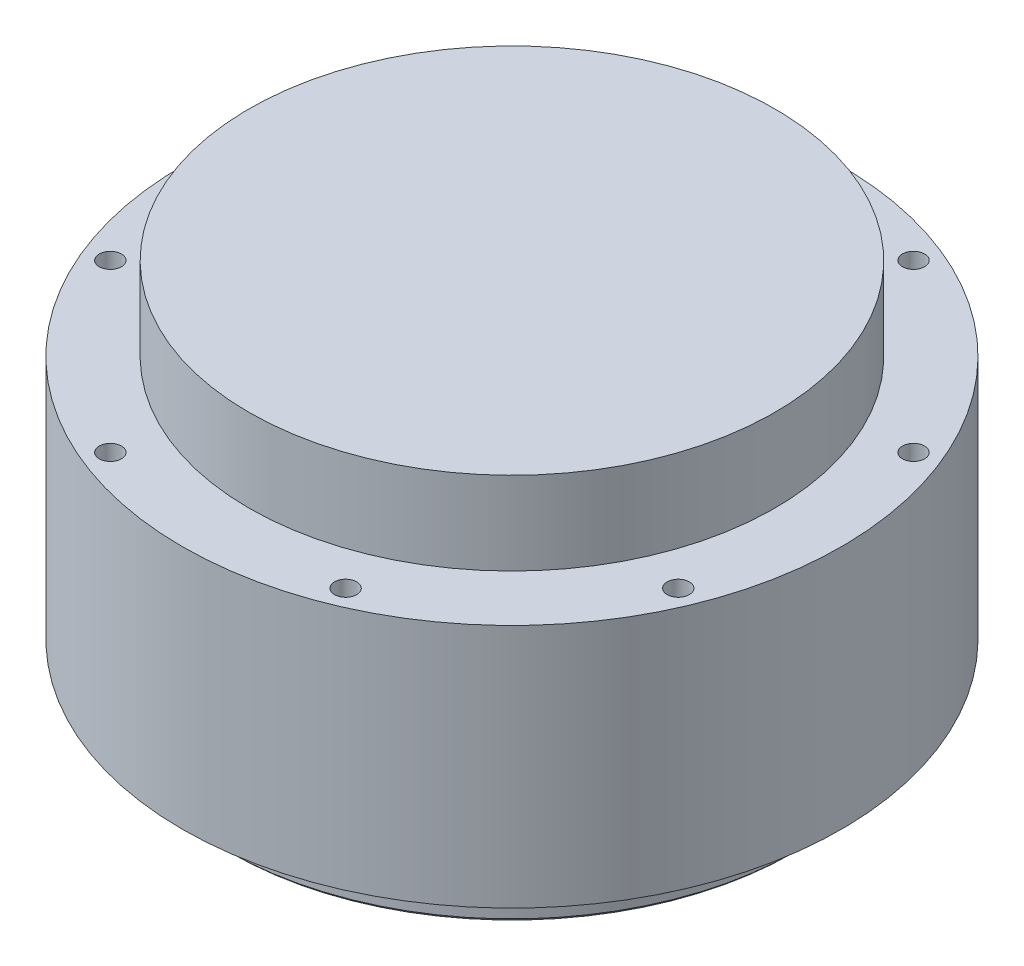
ISO-10303-21;
HEADER;
FILE_DESCRIPTION(('STEP AP214'),'2;1');
FILE_NAME('part.step','',(''),(''),'','','');
FILE_SCHEMA(('AUTOMOTIVE_DESIGN { 1 0 10303 214 1 1 1 1 }'));
ENDSEC;
DATA;
#1=APPLICATION_CONTEXT('core data for automotive mechanical design processes');
#2=APPLICATION_PROTOCOL_DEFINITION('international standard','automotive_design',2000,#1);
#3=PRODUCT_CONTEXT('',#1,'mechanical');
#4=PRODUCT('Part','Part','',(#3));
#5=PRODUCT_RELATED_PRODUCT_CATEGORY('part','',(#4));
#6=PRODUCT_DEFINITION_FORMATION('','',#4);
#7=PRODUCT_DEFINITION_CONTEXT('part definition',#1,'design');
#8=PRODUCT_DEFINITION('design','',#6,#7);
#9=PRODUCT_DEFINITION_SHAPE('','',#8);
#10=(LENGTH_UNIT() NAMED_UNIT(*) SI_UNIT(.MILLI.,.METRE.));
#11=(NAMED_UNIT(*) PLANE_ANGLE_UNIT() SI_UNIT($,.RADIAN.));
#12=(NAMED_UNIT(*) SI_UNIT($,.STERADIAN.) SOLID_ANGLE_UNIT());
#13=UNCERTAINTY_MEASURE_WITH_UNIT(LENGTH_MEASURE(1.E-05),#10,'distance_accuracy_value','');
#14=(GEOMETRIC_REPRESENTATION_CONTEXT(3) GLOBAL_UNCERTAINTY_ASSIGNED_CONTEXT((#13)) GLOBAL_UNIT_ASSIGNED_CONTEXT((#10,
#11,#12)) REPRESENTATION_CONTEXT('',''));
#15=CARTESIAN_POINT('',(0.,0.,0.));
#16=DIRECTION('',(0.,0.,1.));
#17=DIRECTION('',(1.,0.,0.));
#18=AXIS2_PLACEMENT_3D('',#15,#16,#17);
#19=CARTESIAN_POINT('',(0.,33.05,0.));
#20=DIRECTION('',(0.,1.,0.));
#21=DIRECTION('',(0.,0.,1.));
#22=AXIS2_PLACEMENT_3D('',#19,#20,#21);
#23=PLANE('',#22);
#24=CARTESIAN_POINT('',(0.,33.05,0.));
#25=DIRECTION('',(0.,1.,0.));
#26=DIRECTION('',(0.,0.,1.));
#27=AXIS2_PLACEMENT_3D('',#24,#25,#26);
#28=CIRCLE('',#27,35.5);
#29=CARTESIAN_POINT('',(0.,33.05,35.5));
#30=VERTEX_POINT('',#29);
#31=EDGE_CURVE('E110',#30,#30,#28,.T.);
#32=ORIENTED_EDGE('',*,*,#31,.F.);
#33=EDGE_LOOP('',(#32));
#34=FACE_BOUND('',#33,.T.);
#35=CARTESIAN_POINT('',(-38.3410005992179,33.05,-15.8813624431494));
#36=DIRECTION('',(0.,1.,0.));
#37=DIRECTION('',(0.,0.,1.));
#38=AXIS2_PLACEMENT_3D('',#35,#36,#37);
#39=CIRCLE('',#38,1.50000000000199);
#40=CARTESIAN_POINT('',(-38.3410005992179,33.05,-14.3813624431474));
#41=VERTEX_POINT('',#40);
#42=EDGE_CURVE('E95',#41,#41,#39,.T.);
#43=ORIENTED_EDGE('',*,*,#42,.F.);
#44=EDGE_LOOP('',(#43));
#45=FACE_BOUND('',#44,.T.);
#46=CARTESIAN_POINT('',(-15.8813624431488,33.05,38.3410005992194));
#47=DIRECTION('',(0.,1.,0.));
#48=DIRECTION('',(0.,0.,1.));
#49=AXIS2_PLACEMENT_3D('',#46,#47,#48);
#50=CIRCLE('',#49,1.50000000000202);
#51=CARTESIAN_POINT('',(-15.8813624431488,33.05,39.8410005992215));
#52=VERTEX_POINT('',#51);
#53=EDGE_CURVE('E83',#52,#52,#50,.T.);
#54=ORIENTED_EDGE('',*,*,#53,.F.);
#55=EDGE_LOOP('',(#54));
#56=FACE_BOUND('',#55,.T.);
#57=CARTESIAN_POINT('',(38.34100059922,33.05,15.8813624431504));
#58=DIRECTION('',(0.,1.,0.));
#59=DIRECTION('',(0.,0.,1.));
#60=AXIS2_PLACEMENT_3D('',#57,#58,#59);
#61=CIRCLE('',#60,1.50000000000025);
#62=CARTESIAN_POINT('',(38.34100059922,33.05,17.3813624431506));
#63=VERTEX_POINT('',#62);
#64=EDGE_CURVE('E71',#63,#63,#61,.T.);
#65=ORIENTED_EDGE('',*,*,#64,.F.);
#66=EDGE_LOOP('',(#65));
#67=FACE_BOUND('',#66,.T.);
#68=CARTESIAN_POINT('',(15.881362443151,33.05,-38.3410005992185));
#69=DIRECTION('',(0.,1.,0.));
#70=DIRECTION('',(0.,0.,1.));
#71=AXIS2_PLACEMENT_3D('',#68,#69,#70);
#72=CIRCLE('',#71,1.5);
#73=CARTESIAN_POINT('',(15.881362443151,33.05,-36.8410005992185));
#74=VERTEX_POINT('',#73);
#75=EDGE_CURVE('E59',#74,#74,#72,.T.);
#76=ORIENTED_EDGE('',*,*,#75,.F.);
#77=EDGE_LOOP('',(#76));
#78=FACE_BOUND('',#77,.T.);
#79=CARTESIAN_POINT('',(0.,33.05,0.));
#80=DIRECTION('',(0.,1.,0.));
#81=DIRECTION('',(0.,0.,1.));
#82=AXIS2_PLACEMENT_3D('',#79,#80,#81);
#83=CIRCLE('',#82,44.5);
#84=CARTESIAN_POINT('',(0.,33.05,44.5));
#85=VERTEX_POINT('',#84);
#86=EDGE_CURVE('E53',#85,#85,#83,.T.);
#87=ORIENTED_EDGE('',*,*,#86,.T.);
#88=EDGE_LOOP('',(#87));
#89=FACE_BOUND('',#88,.T.);
#90=CARTESIAN_POINT('',(38.3410005992183,33.05,-15.8813624431514));
#91=DIRECTION('',(0.,1.,0.));
#92=DIRECTION('',(0.,0.,1.));
#93=AXIS2_PLACEMENT_3D('',#90,#91,#92);
#94=CIRCLE('',#93,1.50000000000001);
#95=CARTESIAN_POINT('',(38.3410005992183,33.05,-14.3813624431514));
#96=VERTEX_POINT('',#95);
#97=EDGE_CURVE('E65',#96,#96,#94,.T.);
#98=ORIENTED_EDGE('',*,*,#97,.F.);
#99=EDGE_LOOP('',(#98));
#100=FACE_BOUND('',#99,.T.);
#101=CARTESIAN_POINT('',(15.8813624431536,33.05,38.3410005992183));
#102=DIRECTION('',(0.,1.,0.));
#103=DIRECTION('',(0.,0.,1.));
#104=AXIS2_PLACEMENT_3D('',#101,#102,#103);
#105=CIRCLE('',#104,1.50000000000115);
#106=CARTESIAN_POINT('',(15.8813624431536,33.05,39.8410005992195));
#107=VERTEX_POINT('',#106);
#108=EDGE_CURVE('E77',#107,#107,#105,.T.);
#109=ORIENTED_EDGE('',*,*,#108,.F.);
#110=EDGE_LOOP('',(#109));
#111=FACE_BOUND('',#110,.T.);
#112=CARTESIAN_POINT('',(-38.3410005992168,33.05,15.881362443153));
#113=DIRECTION('',(0.,1.,0.));
#114=DIRECTION('',(0.,0.,1.));
#115=AXIS2_PLACEMENT_3D('',#112,#113,#114);
#116=CIRCLE('',#115,1.50000000000235);
#117=CARTESIAN_POINT('',(-38.3410005992168,33.05,17.3813624431554));
#118=VERTEX_POINT('',#117);
#119=EDGE_CURVE('E89',#118,#118,#116,.T.);
#120=ORIENTED_EDGE('',*,*,#119,.F.);
#121=EDGE_LOOP('',(#120));
#122=FACE_BOUND('',#121,.T.);
#123=CARTESIAN_POINT('',(-15.8813624431515,33.05,-38.3410005992174));
#124=DIRECTION('',(0.,1.,0.));
#125=DIRECTION('',(0.,0.,1.));
#126=AXIS2_PLACEMENT_3D('',#123,#124,#125);
#127=CIRCLE('',#126,1.50000000000119);
#128=CARTESIAN_POINT('',(-15.8813624431515,33.05,-36.8410005992162));
#129=VERTEX_POINT('',#128);
#130=EDGE_CURVE('E101',#129,#129,#127,.T.);
#131=ORIENTED_EDGE('',*,*,#130,.F.);
#132=EDGE_LOOP('',(#131));
#133=FACE_BOUND('',#132,.T.);
#134=ADVANCED_FACE('F37',(#34,#45,#56,#67,#78,#89,#100,#111,#122,#133),#23,.T.);
#135=CARTESIAN_POINT('',(0.,0.,0.));
#136=DIRECTION('',(0.,1.,0.));
#137=DIRECTION('',(0.,0.,1.));
#138=AXIS2_PLACEMENT_3D('',#135,#136,#137);
#139=PLANE('',#138);
#140=CARTESIAN_POINT('',(0.,0.,0.));
#141=DIRECTION('',(0.,-1.,0.));
#142=DIRECTION('',(0.,0.,-1.));
#143=AXIS2_PLACEMENT_3D('',#140,#141,#142);
#144=CIRCLE('',#143,38.5);
#145=CARTESIAN_POINT('',(0.,0.,-38.5));
#146=VERTEX_POINT('',#145);
#147=EDGE_CURVE('E49',#146,#146,#144,.T.);
#148=ORIENTED_EDGE('',*,*,#147,.F.);
#149=EDGE_LOOP('',(#148));
#150=FACE_BOUND('',#149,.T.);
#151=CARTESIAN_POINT('',(0.,0.,0.));
#152=DIRECTION('',(0.,1.,0.));
#153=DIRECTION('',(0.,0.,1.));
#154=AXIS2_PLACEMENT_3D('',#151,#152,#153);
#155=CIRCLE('',#154,44.5);
#156=CARTESIAN_POINT('',(0.,0.,44.5));
#157=VERTEX_POINT('',#156);
#158=EDGE_CURVE('E56',#157,#157,#155,.T.);
#159=ORIENTED_EDGE('',*,*,#158,.F.);
#160=EDGE_LOOP('',(#159));
#161=FACE_BOUND('',#160,.T.);
#162=CARTESIAN_POINT('',(15.881362443151,0.,-38.3410005992185));
#163=DIRECTION('',(0.,1.,0.));
#164=DIRECTION('',(0.,0.,1.));
#165=AXIS2_PLACEMENT_3D('',#162,#163,#164);
#166=CIRCLE('',#165,1.5);
#167=CARTESIAN_POINT('',(15.881362443151,0.,-36.8410005992185));
#168=VERTEX_POINT('',#167);
#169=EDGE_CURVE('E62',#168,#168,#166,.T.);
#170=ORIENTED_EDGE('',*,*,#169,.T.);
#171=EDGE_LOOP('',(#170));
#172=FACE_BOUND('',#171,.T.);
#173=CARTESIAN_POINT('',(38.3410005992183,0.,-15.8813624431514));
#174=DIRECTION('',(0.,1.,0.));
#175=DIRECTION('',(0.,0.,1.));
#176=AXIS2_PLACEMENT_3D('',#173,#174,#175);
#177=CIRCLE('',#176,1.50000000000001);
#178=CARTESIAN_POINT('',(38.3410005992183,0.,-14.3813624431514));
#179=VERTEX_POINT('',#178);
#180=EDGE_CURVE('E68',#179,#179,#177,.T.);
#181=ORIENTED_EDGE('',*,*,#180,.T.);
#182=EDGE_LOOP('',(#181));
#183=FACE_BOUND('',#182,.T.);
#184=CARTESIAN_POINT('',(38.34100059922,0.,15.8813624431504));
#185=DIRECTION('',(0.,1.,0.));
#186=DIRECTION('',(0.,0.,1.));
#187=AXIS2_PLACEMENT_3D('',#184,#185,#186);
#188=CIRCLE('',#187,1.50000000000025);
#189=CARTESIAN_POINT('',(38.34100059922,0.,17.3813624431506));
#190=VERTEX_POINT('',#189);
#191=EDGE_CURVE('E74',#190,#190,#188,.T.);
#192=ORIENTED_EDGE('',*,*,#191,.T.);
#193=EDGE_LOOP('',(#192));
#194=FACE_BOUND('',#193,.T.);
#195=CARTESIAN_POINT('',(15.8813624431536,0.,38.3410005992183));
#196=DIRECTION('',(0.,1.,0.));
#197=DIRECTION('',(0.,0.,1.));
#198=AXIS2_PLACEMENT_3D('',#195,#196,#197);
#199=CIRCLE('',#198,1.50000000000115);
#200=CARTESIAN_POINT('',(15.8813624431536,0.,39.8410005992195));
#201=VERTEX_POINT('',#200);
#202=EDGE_CURVE('E80',#201,#201,#199,.T.);
#203=ORIENTED_EDGE('',*,*,#202,.T.);
#204=EDGE_LOOP('',(#203));
#205=FACE_BOUND('',#204,.T.);
#206=CARTESIAN_POINT('',(-15.8813624431488,0.,38.3410005992194));
#207=DIRECTION('',(0.,1.,0.));
#208=DIRECTION('',(0.,0.,1.));
#209=AXIS2_PLACEMENT_3D('',#206,#207,#208);
#210=CIRCLE('',#209,1.50000000000202);
#211=CARTESIAN_POINT('',(-15.8813624431488,0.,39.8410005992215));
#212=VERTEX_POINT('',#211);
#213=EDGE_CURVE('E86',#212,#212,#210,.T.);
#214=ORIENTED_EDGE('',*,*,#213,.T.);
#215=EDGE_LOOP('',(#214));
#216=FACE_BOUND('',#215,.T.);
#217=CARTESIAN_POINT('',(-38.3410005992168,0.,15.881362443153));
#218=DIRECTION('',(0.,1.,0.));
#219=DIRECTION('',(0.,0.,1.));
#220=AXIS2_PLACEMENT_3D('',#217,#218,#219);
#221=CIRCLE('',#220,1.50000000000235);
#222=CARTESIAN_POINT('',(-38.3410005992168,0.,17.3813624431554));
#223=VERTEX_POINT('',#222);
#224=EDGE_CURVE('E92',#223,#223,#221,.T.);
#225=ORIENTED_EDGE('',*,*,#224,.T.);
#226=EDGE_LOOP('',(#225));
#227=FACE_BOUND('',#226,.T.);
#228=CARTESIAN_POINT('',(-38.3410005992179,0.,-15.8813624431494));
#229=DIRECTION('',(0.,1.,0.));
#230=DIRECTION('',(0.,0.,1.));
#231=AXIS2_PLACEMENT_3D('',#228,#229,#230);
#232=CIRCLE('',#231,1.50000000000199);
#233=CARTESIAN_POINT('',(-38.3410005992179,0.,-14.3813624431474));
#234=VERTEX_POINT('',#233);
#235=EDGE_CURVE('E98',#234,#234,#232,.T.);
#236=ORIENTED_EDGE('',*,*,#235,.T.);
#237=EDGE_LOOP('',(#236));
#238=FACE_BOUND('',#237,.T.);
#239=CARTESIAN_POINT('',(-15.8813624431515,0.,-38.3410005992174));
#240=DIRECTION('',(0.,1.,0.));
#241=DIRECTION('',(0.,0.,1.));
#242=AXIS2_PLACEMENT_3D('',#239,#240,#241);
#243=CIRCLE('',#242,1.50000000000119);
#244=CARTESIAN_POINT('',(-15.8813624431515,0.,-36.8410005992162));
#245=VERTEX_POINT('',#244);
#246=EDGE_CURVE('E104',#245,#245,#243,.T.);
#247=ORIENTED_EDGE('',*,*,#246,.T.);
#248=EDGE_LOOP('',(#247));
#249=FACE_BOUND('',#248,.T.);
#250=ADVANCED_FACE('F142',(#150,#161,#172,#183,#194,#205,#216,#227,#238,#249),#139,.F.);
#251=CARTESIAN_POINT('',(0.,33.05,0.));
#252=DIRECTION('',(0.,-1.,0.));
#253=DIRECTION('',(0.,0.,-1.));
#254=AXIS2_PLACEMENT_3D('',#251,#252,#253);
#255=CYLINDRICAL_SURFACE('',#254,44.5);
#256=ORIENTED_EDGE('',*,*,#86,.F.);
#257=EDGE_LOOP('',(#256));
#258=FACE_BOUND('',#257,.T.);
#259=ORIENTED_EDGE('',*,*,#158,.T.);
#260=EDGE_LOOP('',(#259));
#261=FACE_BOUND('',#260,.T.);
#262=ADVANCED_FACE('F148',(#258,#261),#255,.T.);
#263=CARTESIAN_POINT('',(15.881362443151,33.05,-38.3410005992185));
#264=DIRECTION('',(0.,-1.,0.));
#265=DIRECTION('',(0.,0.,-1.));
#266=AXIS2_PLACEMENT_3D('',#263,#264,#265);
#267=CYLINDRICAL_SURFACE('',#266,1.5);
#268=ORIENTED_EDGE('',*,*,#75,.T.);
#269=EDGE_LOOP('',(#268));
#270=FACE_BOUND('',#269,.T.);
#271=ORIENTED_EDGE('',*,*,#169,.F.);
#272=EDGE_LOOP('',(#271));
#273=FACE_BOUND('',#272,.T.);
#274=ADVANCED_FACE('F154',(#270,#273),#267,.F.);
#275=CARTESIAN_POINT('',(38.3410005992183,33.05,-15.8813624431514));
#276=DIRECTION('',(0.,-1.,0.));
#277=DIRECTION('',(0.,0.,-1.));
#278=AXIS2_PLACEMENT_3D('',#275,#276,#277);
#279=CYLINDRICAL_SURFACE('',#278,1.50000000000001);
#280=ORIENTED_EDGE('',*,*,#97,.T.);
#281=EDGE_LOOP('',(#280));
#282=FACE_BOUND('',#281,.T.);
#283=ORIENTED_EDGE('',*,*,#180,.F.);
#284=EDGE_LOOP('',(#283));
#285=FACE_BOUND('',#284,.T.);
#286=ADVANCED_FACE('F161',(#282,#285),#279,.F.);
#287=CARTESIAN_POINT('',(38.34100059922,33.05,15.8813624431504));
#288=DIRECTION('',(0.,-1.,0.));
#289=DIRECTION('',(0.,0.,-1.));
#290=AXIS2_PLACEMENT_3D('',#287,#288,#289);
#291=CYLINDRICAL_SURFACE('',#290,1.50000000000025);
#292=ORIENTED_EDGE('',*,*,#64,.T.);
#293=EDGE_LOOP('',(#292));
#294=FACE_BOUND('',#293,.T.);
#295=ORIENTED_EDGE('',*,*,#191,.F.);
#296=EDGE_LOOP('',(#295));
#297=FACE_BOUND('',#296,.T.);
#298=ADVANCED_FACE('F211',(#294,#297),#291,.F.);
#299=CARTESIAN_POINT('',(15.8813624431536,33.05,38.3410005992183));
#300=DIRECTION('',(0.,-1.,0.));
#301=DIRECTION('',(0.,0.,-1.));
#302=AXIS2_PLACEMENT_3D('',#299,#300,#301);
#303=CYLINDRICAL_SURFACE('',#302,1.50000000000115);
#304=ORIENTED_EDGE('',*,*,#108,.T.);
#305=EDGE_LOOP('',(#304));
#306=FACE_BOUND('',#305,.T.);
#307=ORIENTED_EDGE('',*,*,#202,.F.);
#308=EDGE_LOOP('',(#307));
#309=FACE_BOUND('',#308,.T.);
#310=ADVANCED_FACE('F207',(#306,#309),#303,.F.);
#311=CARTESIAN_POINT('',(-15.8813624431488,33.05,38.3410005992194));
#312=DIRECTION('',(0.,-1.,0.));
#313=DIRECTION('',(0.,0.,-1.));
#314=AXIS2_PLACEMENT_3D('',#311,#312,#313);
#315=CYLINDRICAL_SURFACE('',#314,1.50000000000202);
#316=ORIENTED_EDGE('',*,*,#53,.T.);
#317=EDGE_LOOP('',(#316));
#318=FACE_BOUND('',#317,.T.);
#319=ORIENTED_EDGE('',*,*,#213,.F.);
#320=EDGE_LOOP('',(#319));
#321=FACE_BOUND('',#320,.T.);
#322=ADVANCED_FACE('F203',(#318,#321),#315,.F.);
#323=CARTESIAN_POINT('',(-38.3410005992168,33.05,15.881362443153));
#324=DIRECTION('',(0.,-1.,0.));
#325=DIRECTION('',(0.,0.,-1.));
#326=AXIS2_PLACEMENT_3D('',#323,#324,#325);
#327=CYLINDRICAL_SURFACE('',#326,1.50000000000235);
#328=ORIENTED_EDGE('',*,*,#119,.T.);
#329=EDGE_LOOP('',(#328));
#330=FACE_BOUND('',#329,.T.);
#331=ORIENTED_EDGE('',*,*,#224,.F.);
#332=EDGE_LOOP('',(#331));
#333=FACE_BOUND('',#332,.T.);
#334=ADVANCED_FACE('F196',(#330,#333),#327,.F.);
#335=CARTESIAN_POINT('',(-38.3410005992179,33.05,-15.8813624431494));
#336=DIRECTION('',(0.,-1.,0.));
#337=DIRECTION('',(0.,0.,-1.));
#338=AXIS2_PLACEMENT_3D('',#335,#336,#337);
#339=CYLINDRICAL_SURFACE('',#338,1.50000000000199);
#340=ORIENTED_EDGE('',*,*,#42,.T.);
#341=EDGE_LOOP('',(#340));
#342=FACE_BOUND('',#341,.T.);
#343=ORIENTED_EDGE('',*,*,#235,.F.);
#344=EDGE_LOOP('',(#343));
#345=FACE_BOUND('',#344,.T.);
#346=ADVANCED_FACE('F187',(#342,#345),#339,.F.);
#347=CARTESIAN_POINT('',(-15.8813624431515,33.05,-38.3410005992174));
#348=DIRECTION('',(0.,-1.,0.));
#349=DIRECTION('',(0.,0.,-1.));
#350=AXIS2_PLACEMENT_3D('',#347,#348,#349);
#351=CYLINDRICAL_SURFACE('',#350,1.50000000000119);
#352=ORIENTED_EDGE('',*,*,#130,.T.);
#353=EDGE_LOOP('',(#352));
#354=FACE_BOUND('',#353,.T.);
#355=ORIENTED_EDGE('',*,*,#246,.F.);
#356=EDGE_LOOP('',(#355));
#357=FACE_BOUND('',#356,.T.);
#358=ADVANCED_FACE('F184',(#354,#357),#351,.F.);
#359=CARTESIAN_POINT('',(0.,44.25,0.));
#360=DIRECTION('',(0.,-1.,0.));
#361=DIRECTION('',(0.,0.,-1.));
#362=AXIS2_PLACEMENT_3D('',#359,#360,#361);
#363=CYLINDRICAL_SURFACE('',#362,35.5);
#364=CARTESIAN_POINT('',(0.,44.25,0.));
#365=DIRECTION('',(0.,1.,0.));
#366=DIRECTION('',(0.,0.,1.));
#367=AXIS2_PLACEMENT_3D('',#364,#365,#366);
#368=CIRCLE('',#367,35.5);
#369=CARTESIAN_POINT('',(0.,44.25,35.5));
#370=VERTEX_POINT('',#369);
#371=EDGE_CURVE('E107',#370,#370,#368,.T.);
#372=ORIENTED_EDGE('',*,*,#371,.F.);
#373=EDGE_LOOP('',(#372));
#374=FACE_BOUND('',#373,.T.);
#375=ORIENTED_EDGE('',*,*,#31,.T.);
#376=EDGE_LOOP('',(#375));
#377=FACE_BOUND('',#376,.T.);
#378=ADVANCED_FACE('F186',(#374,#377),#363,.T.);
#379=CARTESIAN_POINT('',(0.,44.25,0.));
#380=DIRECTION('',(0.,1.,0.));
#381=DIRECTION('',(0.,0.,1.));
#382=AXIS2_PLACEMENT_3D('',#379,#380,#381);
#383=PLANE('',#382);
#384=ORIENTED_EDGE('',*,*,#371,.T.);
#385=EDGE_LOOP('',(#384));
#386=FACE_BOUND('',#385,.T.);
#387=ADVANCED_FACE('F139',(#386),#383,.T.);
#388=CARTESIAN_POINT('',(0.,-6.,0.));
#389=DIRECTION('',(0.,1.,0.));
#390=DIRECTION('',(0.,0.,1.));
#391=AXIS2_PLACEMENT_3D('',#388,#389,#390);
#392=CYLINDRICAL_SURFACE('',#391,38.5);
#393=CARTESIAN_POINT('',(0.,-5.50000000000003,0.));
#394=DIRECTION('',(0.,-1.,0.));
#395=DIRECTION('',(0.,0.,-1.));
#396=AXIS2_PLACEMENT_3D('',#393,#394,#395);
#397=CIRCLE('',#396,38.5);
#398=CARTESIAN_POINT('',(0.,-5.50000000000003,-38.5));
#399=VERTEX_POINT('',#398);
#400=EDGE_CURVE('E10',#399,#399,#397,.F.);
#401=ORIENTED_EDGE('',*,*,#400,.T.);
#402=EDGE_LOOP('',(#401));
#403=FACE_BOUND('',#402,.T.);
#404=ORIENTED_EDGE('',*,*,#147,.T.);
#405=EDGE_LOOP('',(#404));
#406=FACE_BOUND('',#405,.T.);
#407=ADVANCED_FACE('F132',(#403,#406),#392,.T.);
#408=CARTESIAN_POINT('',(0.,-6.,0.));
#409=DIRECTION('',(0.,-1.,0.));
#410=DIRECTION('',(0.,0.,-1.));
#411=AXIS2_PLACEMENT_3D('',#408,#409,#410);
#412=PLANE('',#411);
#413=CARTESIAN_POINT('',(0.,-6.,0.));
#414=DIRECTION('',(0.,-1.,0.));
#415=DIRECTION('',(0.,0.,-1.));
#416=AXIS2_PLACEMENT_3D('',#413,#414,#415);
#417=CIRCLE('',#416,17.5);
#418=CARTESIAN_POINT('',(0.,-6.,-17.5));
#419=VERTEX_POINT('',#418);
#420=EDGE_CURVE('E116',#419,#419,#417,.T.);
#421=ORIENTED_EDGE('',*,*,#420,.F.);
#422=EDGE_LOOP('',(#421));
#423=FACE_BOUND('',#422,.T.);
#424=CARTESIAN_POINT('',(0.,-6.,0.));
#425=DIRECTION('',(0.,-1.,0.));
#426=DIRECTION('',(0.,0.,-1.));
#427=AXIS2_PLACEMENT_3D('',#424,#425,#426);
#428=CIRCLE('',#427,38.);
#429=CARTESIAN_POINT('',(0.,-6.,-38.));
#430=VERTEX_POINT('',#429);
#431=EDGE_CURVE('E45',#430,#430,#428,.T.);
#432=ORIENTED_EDGE('',*,*,#431,.T.);
#433=EDGE_LOOP('',(#432));
#434=FACE_BOUND('',#433,.T.);
#435=ADVANCED_FACE('F130',(#423,#434),#412,.T.);
#436=CARTESIAN_POINT('',(0.,-6.,0.));
#437=DIRECTION('',(0.,1.,0.));
#438=DIRECTION('',(0.,0.,1.));
#439=AXIS2_PLACEMENT_3D('',#436,#437,#438);
#440=CONICAL_SURFACE('',#439,38.,0.785398163397469);
#441=ORIENTED_EDGE('',*,*,#400,.F.);
#442=EDGE_LOOP('',(#441));
#443=FACE_BOUND('',#442,.T.);
#444=ORIENTED_EDGE('',*,*,#431,.F.);
#445=EDGE_LOOP('',(#444));
#446=FACE_BOUND('',#445,.T.);
#447=ADVANCED_FACE('F40',(#443,#446),#440,.T.);
#448=CARTESIAN_POINT('',(0.,9.,0.));
#449=DIRECTION('',(0.,-1.,0.));
#450=DIRECTION('',(0.,0.,-1.));
#451=AXIS2_PLACEMENT_3D('',#448,#449,#450);
#452=CYLINDRICAL_SURFACE('',#451,17.5);
#453=CARTESIAN_POINT('',(0.,9.,0.));
#454=DIRECTION('',(0.,-1.,0.));
#455=DIRECTION('',(0.,0.,-1.));
#456=AXIS2_PLACEMENT_3D('',#453,#454,#455);
#457=CIRCLE('',#456,17.5);
#458=CARTESIAN_POINT('',(0.,9.,-17.5));
#459=VERTEX_POINT('',#458);
#460=EDGE_CURVE('E113',#459,#459,#457,.T.);
#461=ORIENTED_EDGE('',*,*,#460,.F.);
#462=EDGE_LOOP('',(#461));
#463=FACE_BOUND('',#462,.T.);
#464=ORIENTED_EDGE('',*,*,#420,.T.);
#465=EDGE_LOOP('',(#464));
#466=FACE_BOUND('',#465,.T.);
#467=ADVANCED_FACE('F124',(#463,#466),#452,.F.);
#468=CARTESIAN_POINT('',(0.,9.,0.));
#469=DIRECTION('',(0.,-1.,0.));
#470=DIRECTION('',(0.,0.,-1.));
#471=AXIS2_PLACEMENT_3D('',#468,#469,#470);
#472=PLANE('',#471);
#473=ORIENTED_EDGE('',*,*,#460,.T.);
#474=EDGE_LOOP('',(#473));
#475=FACE_BOUND('',#474,.T.);
#476=ADVANCED_FACE('F122',(#475),#472,.T.);
#477=CLOSED_SHELL('',(#134,#250,#262,#274,#286,#298,#310,#322,#334,#346,#358,#378,#387,#407,
#435,#447,#467,#476));
#478=MANIFOLD_SOLID_BREP('B2',#477);
#479=ADVANCED_BREP_SHAPE_REPRESENTATION('',(#18,#478),#14);
#480=SHAPE_DEFINITION_REPRESENTATION(#9,#479);
ENDSEC;
END-ISO-10303-21;
